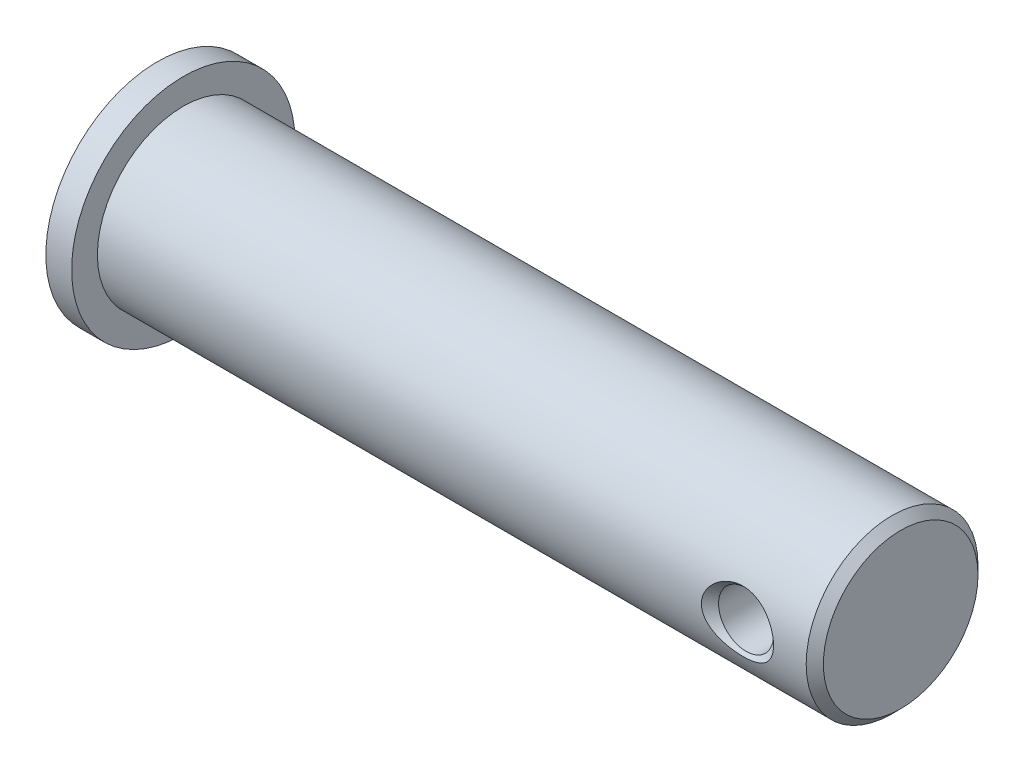
ISO-10303-21;
HEADER;
FILE_DESCRIPTION(('STEP AP214'),'2;1');
FILE_NAME('part.step','',(''),(''),'','','');
FILE_SCHEMA(('AUTOMOTIVE_DESIGN { 1 0 10303 214 1 1 1 1 }'));
ENDSEC;
DATA;
#1=APPLICATION_CONTEXT('core data for automotive mechanical design processes');
#2=APPLICATION_PROTOCOL_DEFINITION('international standard','automotive_design',2000,#1);
#3=PRODUCT_CONTEXT('',#1,'mechanical');
#4=PRODUCT('Part','Part','',(#3));
#5=PRODUCT_RELATED_PRODUCT_CATEGORY('part','',(#4));
#6=PRODUCT_DEFINITION_FORMATION('','',#4);
#7=PRODUCT_DEFINITION_CONTEXT('part definition',#1,'design');
#8=PRODUCT_DEFINITION('design','',#6,#7);
#9=PRODUCT_DEFINITION_SHAPE('','',#8);
#10=(LENGTH_UNIT() NAMED_UNIT(*) SI_UNIT(.MILLI.,.METRE.));
#11=(NAMED_UNIT(*) PLANE_ANGLE_UNIT() SI_UNIT($,.RADIAN.));
#12=(NAMED_UNIT(*) SI_UNIT($,.STERADIAN.) SOLID_ANGLE_UNIT());
#13=UNCERTAINTY_MEASURE_WITH_UNIT(LENGTH_MEASURE(1.E-05),#10,'distance_accuracy_value','');
#14=(GEOMETRIC_REPRESENTATION_CONTEXT(3) GLOBAL_UNCERTAINTY_ASSIGNED_CONTEXT((#13)) GLOBAL_UNIT_ASSIGNED_CONTEXT((#10,
#11,#12)) REPRESENTATION_CONTEXT('',''));
#15=CARTESIAN_POINT('',(0.,0.,0.));
#16=DIRECTION('',(0.,0.,1.));
#17=DIRECTION('',(1.,0.,0.));
#18=AXIS2_PLACEMENT_3D('',#15,#16,#17);
#19=CARTESIAN_POINT('',(80.5,0.,0.));
#20=DIRECTION('',(1.,0.,0.));
#21=DIRECTION('',(0.,0.,-1.));
#22=AXIS2_PLACEMENT_3D('',#19,#20,#21);
#23=CYLINDRICAL_SURFACE('',#22,10.);
#24=CARTESIAN_POINT('',(79.5,0.,0.));
#25=DIRECTION('',(1.,0.,0.));
#26=DIRECTION('',(0.,0.,-1.));
#27=AXIS2_PLACEMENT_3D('',#24,#25,#26);
#28=CIRCLE('',#27,10.);
#29=CARTESIAN_POINT('',(79.5,0.,-10.));
#30=VERTEX_POINT('',#29);
#31=EDGE_CURVE('E79',#30,#30,#28,.T.);
#32=ORIENTED_EDGE('',*,*,#31,.F.);
#33=EDGE_LOOP('',(#32));
#34=FACE_BOUND('',#33,.T.);
#35=CARTESIAN_POINT('',(68.7207995689269,-2.652458286531,9.64180822500725));
#36=CARTESIAN_POINT('',(68.9162396684258,-2.79888593025584,9.601529561183));
#37=CARTESIAN_POINT('',(69.1250545250733,-2.92815257269296,9.56240293505168));
#38=CARTESIAN_POINT('',(69.5622804572271,-3.15115567598001,9.49125843281005));
#39=CARTESIAN_POINT('',(69.7907327941659,-3.24481496641895,9.45925605827572));
#40=CARTESIAN_POINT('',(70.2620811204951,-3.39590589193739,9.40607794429715));
#41=CARTESIAN_POINT('',(70.5050556421177,-3.45311648734387,9.38496840739309));
#42=CARTESIAN_POINT('',(70.997504708861,-3.52957652742551,9.35648293032397));
#43=CARTESIAN_POINT('',(71.2469747073791,-3.54885183817462,9.34909763251438));
#44=CARTESIAN_POINT('',(71.7539876396611,-3.54921320468752,9.34896307431086));
#45=CARTESIAN_POINT('',(72.0115326583534,-3.52905352433109,9.35669124043494));
#46=CARTESIAN_POINT('',(72.5194906078579,-3.4483642676975,9.38672469455826));
#47=CARTESIAN_POINT('',(72.7698992859823,-3.38781112384351,9.4090384923952));
#48=CARTESIAN_POINT('',(73.2565097143582,-3.22713739480101,9.46534775081235));
#49=CARTESIAN_POINT('',(73.492700790871,-3.12698749925746,9.49935186237242));
#50=CARTESIAN_POINT('',(73.9434823815501,-2.88810989592092,9.57467769125102));
#51=CARTESIAN_POINT('',(74.1580836665996,-2.7494015557505,9.61599573106271));
#52=CARTESIAN_POINT('',(74.5209505621705,-2.46354346859632,9.6927098398484));
#53=CARTESIAN_POINT('',(74.6741681171345,-2.32258710214281,9.72780540134029));
#54=CARTESIAN_POINT('',(74.9553684875337,-2.01695564984647,9.79572831903019));
#55=CARTESIAN_POINT('',(75.0833840362068,-1.85231181792954,9.8285585809745));
#56=CARTESIAN_POINT('',(75.2895825772847,-1.53043212671961,9.88331330568309));
#57=CARTESIAN_POINT('',(75.3724908402262,-1.37638514864813,9.90614323536279));
#58=CARTESIAN_POINT('',(75.5123455245179,-1.05610354898767,9.94538060596304));
#59=CARTESIAN_POINT('',(75.5693069872926,-0.889876053526071,9.96179176707762));
#60=CARTESIAN_POINT('',(75.6540465556673,-0.548533950869552,9.98641559519326));
#61=CARTESIAN_POINT('',(75.6816715142743,-0.37337766075794,9.99458522750122));
#62=CARTESIAN_POINT('',(75.7051879940211,-0.0207664201440857,10.0015306572451));
#63=CARTESIAN_POINT('',(75.7010895450776,0.156687786118148,10.0003094237703));
#64=CARTESIAN_POINT('',(75.6632866686404,0.492042752687814,9.98917223335483));
#65=CARTESIAN_POINT('',(75.6322439474603,0.650280405663322,9.98003810867936));
#66=CARTESIAN_POINT('',(75.5459621837167,0.959414295070692,9.95507872016221));
#67=CARTESIAN_POINT('',(75.4907194418309,1.11030940516911,9.93925243333987));
#68=CARTESIAN_POINT('',(75.3560932013564,1.40755292934514,9.9016247506062));
#69=CARTESIAN_POINT('',(75.2758197398076,1.55346724146001,9.87960663598689));
#70=CARTESIAN_POINT('',(75.0954498288259,1.83174126829746,9.83182059238777));
#71=CARTESIAN_POINT('',(74.9953448658798,1.96409512446735,9.80605105421451));
#72=CARTESIAN_POINT('',(74.7616713100902,2.23337312259442,9.74853046864709));
#73=CARTESIAN_POINT('',(74.6253199947587,2.36781241465732,9.71647214299449));
#74=CARTESIAN_POINT('',(74.3347688306032,2.61583538230109,9.65265934687057));
#75=CARTESIAN_POINT('',(74.180557149269,2.72940510142533,9.62090509310155));
#76=CARTESIAN_POINT('',(73.8291011257122,2.9534544351064,9.55474314941758));
#77=CARTESIAN_POINT('',(73.6290887665084,3.05976467124335,9.52087342551992));
#78=CARTESIAN_POINT('',(73.214567539742,3.24182204604302,9.46043329610396));
#79=CARTESIAN_POINT('',(73.0000518137653,3.3175546053089,9.43386637447469));
#80=CARTESIAN_POINT('',(72.5378754875408,3.44418371629457,9.38843309476907));
#81=CARTESIAN_POINT('',(72.2891264091848,3.49154923056735,9.37069698902709));
#82=CARTESIAN_POINT('',(71.7867150786559,3.54718312276502,9.3497796838132));
#83=CARTESIAN_POINT('',(71.5330527270962,3.55545070897702,9.34659877907665));
#84=CARTESIAN_POINT('',(71.0231642237489,3.53254980973637,9.35527944243717));
#85=CARTESIAN_POINT('',(70.7669744221963,3.50066691204375,9.36741352443311));
#86=CARTESIAN_POINT('',(70.2638152933643,3.39674067702505,9.40559285626161));
#87=CARTESIAN_POINT('',(70.0168506790951,3.32467710348624,9.43164511543542));
#88=CARTESIAN_POINT('',(69.5391243364109,3.14125562188165,9.49430833365608));
#89=CARTESIAN_POINT('',(69.3083771840143,3.02986289348034,9.5309286439347));
#90=CARTESIAN_POINT('',(68.870710417848,2.76880363775321,9.61000828656391));
#91=CARTESIAN_POINT('',(68.6637733266237,2.61916544728393,9.65246328515283));
#92=CARTESIAN_POINT('',(68.3223454668207,2.31838754254256,9.72850444469805));
#93=CARTESIAN_POINT('',(68.1817631540105,2.17414549541338,9.76208312013869));
#94=CARTESIAN_POINT('',(67.9260220480796,1.86403374514774,9.82600276582618));
#95=CARTESIAN_POINT('',(67.8108294041086,1.69819331350534,9.85634801879863));
#96=CARTESIAN_POINT('',(67.6269946407723,1.37456750903135,9.90621469230017));
#97=CARTESIAN_POINT('',(67.5539214586599,1.21945232038074,9.92668253565411));
#98=CARTESIAN_POINT('',(67.4338113534207,0.898697391293122,9.96083721626635));
#99=CARTESIAN_POINT('',(67.3867600745744,0.733063510133141,9.97452779195793));
#100=CARTESIAN_POINT('',(67.3214492624177,0.394939819891599,9.99363708879264));
#101=CARTESIAN_POINT('',(67.3033130852644,0.22242383849768,9.99902036664391));
#102=CARTESIAN_POINT('',(67.297519893925,-0.123153966758734,10.0007332693515));
#103=CARTESIAN_POINT('',(67.3098573600038,-0.296215686100065,9.99706453381234));
#104=CARTESIAN_POINT('',(67.3621312106315,-0.624857637517196,9.98171831063807));
#105=CARTESIAN_POINT('',(67.4000192549387,-0.780800076980838,9.97063567578646));
#106=CARTESIAN_POINT('',(67.4991217191024,-1.08446626298251,9.94219389467657));
#107=CARTESIAN_POINT('',(67.560345010325,-1.23218685931332,9.92483236149661));
#108=CARTESIAN_POINT('',(67.7076501723328,-1.52531140094414,9.88416267587084));
#109=CARTESIAN_POINT('',(67.7950261333805,-1.67001787351711,9.86055516506876));
#110=CARTESIAN_POINT('',(67.9892369873501,-1.94490380337981,9.81004068919931));
#111=CARTESIAN_POINT('',(68.0960655211576,-2.07508798569518,9.78313480331887));
#112=CARTESIAN_POINT('',(68.2890548318941,-2.28061807182305,9.736840324921));
#113=CARTESIAN_POINT('',(68.3708847474004,-2.36017819838192,9.71780243965988));
#114=CARTESIAN_POINT('',(68.5411033279806,-2.51189340446557,9.67969529344084));
#115=CARTESIAN_POINT('',(68.6294918147562,-2.58404868516825,9.66062603334964));
#116=CARTESIAN_POINT('',(68.7207995689269,-2.652458286531,9.64180822500725));
#117=B_SPLINE_CURVE_WITH_KNOTS('',3,(#35,#36,#37,#38,#39,#40,#41,#42,#43,#44,#45,#46,#47,#48,
#49,#50,#51,#52,#53,#54,#55,#56,#57,#58,#59,#60,#61,#62,#63,#64,#65,#66,#67,#68,#69,#70,#71,#72,
#73,#74,#75,#76,#77,#78,#79,#80,#81,#82,#83,#84,#85,#86,#87,#88,#89,#90,#91,#92,#93,#94,#95,#96,
#97,#98,#99,#100,#101,#102,#103,#104,#105,#106,#107,#108,#109,#110,#111,#112,#113,#114,#115,
#116),.UNSPECIFIED.,.T.,.F.,(4,2,2,2,2,2,2,2,2,2,2,2,2,2,2,2,2,2,2,2,2,2,2,2,2,2,2,2,2,2,2,2,2,
2,2,2,2,2,2,2,4),(0.,0.742098438565734,1.48579615174851,2.23396206426232,2.9816176648374,
3.75327300188976,4.52537895569235,5.29805751193416,6.07034865654456,6.70126618637176,
7.33135877247464,7.85844771509439,8.38523071286466,8.91475038678981,9.44410265054025,
9.92644184828222,10.4088548042714,10.9108760191246,11.4131132167236,11.99338211054,
12.5740376561215,13.2583296763615,13.9429475819511,14.7009283718756,15.4589245104544,
16.2306005248716,17.0026655303423,17.775415810034,18.5475951944257,19.1578173898083,
19.7672210161245,20.2830945245216,20.798683152083,21.3164655282784,21.8341541246793,
22.3146174192971,22.7952635542398,23.3053820917631,23.8153341681462,24.162044916984,
24.5087462437472),.UNSPECIFIED.);
#118=CARTESIAN_POINT('',(68.7207995689269,-2.652458286531,9.64180822500725));
#119=VERTEX_POINT('',#118);
#120=EDGE_CURVE('E26',#119,#119,#117,.T.);
#121=ORIENTED_EDGE('',*,*,#120,.F.);
#122=EDGE_LOOP('',(#121));
#123=FACE_BOUND('',#122,.T.);
#124=CARTESIAN_POINT('',(-3.,0.,0.));
#125=DIRECTION('',(1.,0.,0.));
#126=DIRECTION('',(0.,0.,-1.));
#127=AXIS2_PLACEMENT_3D('',#124,#125,#126);
#128=CIRCLE('',#127,10.);
#129=CARTESIAN_POINT('',(-3.,0.,-10.));
#130=VERTEX_POINT('',#129);
#131=EDGE_CURVE('E84',#130,#130,#128,.T.);
#132=ORIENTED_EDGE('',*,*,#131,.T.);
#133=EDGE_LOOP('',(#132));
#134=FACE_BOUND('',#133,.T.);
#135=CARTESIAN_POINT('',(68.7207995689269,-2.652458286531,-9.64180822500725));
#136=CARTESIAN_POINT('',(68.570674545502,-2.53997973378034,-9.67274996595369));
#137=CARTESIAN_POINT('',(68.4283255556157,-2.41729885645396,-9.7043921906314));
#138=CARTESIAN_POINT('',(68.1629307068794,-2.15222025354344,-9.76659892728099));
#139=CARTESIAN_POINT('',(68.0398809900436,-2.00982647937211,-9.7971636536987));
#140=CARTESIAN_POINT('',(67.8229553080189,-1.71409201692918,-9.853090544974));
#141=CARTESIAN_POINT('',(67.7279532359462,-1.56161809588753,-9.87863321912784));
#142=CARTESIAN_POINT('',(67.5637785508831,-1.24245785182184,-9.92382011712578));
#143=CARTESIAN_POINT('',(67.4945947602925,-1.07577771762629,-9.94346689277895));
#144=CARTESIAN_POINT('',(67.3857864793283,-0.731030891075918,-9.97475197991039));
#145=CARTESIAN_POINT('',(67.3463485058195,-0.552899828609322,-9.98633972368338));
#146=CARTESIAN_POINT('',(67.3006871050349,-0.19208233075768,-9.99978050243662));
#147=CARTESIAN_POINT('',(67.2944442631568,-0.00939862088047326,-10.0016392275494));
#148=CARTESIAN_POINT('',(67.3144508456476,0.334282979201144,-9.99573077703663));
#149=CARTESIAN_POINT('',(67.3372949652106,0.495509646743645,-9.98897232382417));
#150=CARTESIAN_POINT('',(67.4083499954111,0.811751714376884,-9.96825863991053));
#151=CARTESIAN_POINT('',(67.4565635424569,0.966766467119059,-9.95430266124056));
#152=CARTESIAN_POINT('',(67.5766973971463,1.26933276024558,-9.9203009077393));
#153=CARTESIAN_POINT('',(67.6489748497413,1.41673067455915,-9.90016376966042));
#154=CARTESIAN_POINT('',(67.8137927096571,1.69896208700442,-9.85565711039016));
#155=CARTESIAN_POINT('',(67.9063407086923,1.83379085070093,-9.83128600420439));
#156=CARTESIAN_POINT('',(68.1229987746614,2.10766351044549,-9.77650042100304));
#157=CARTESIAN_POINT('',(68.2497293159679,2.2445556643643,-9.74572003647428));
#158=CARTESIAN_POINT('',(68.5213338391407,2.49880160358973,-9.68365365046563));
#159=CARTESIAN_POINT('',(68.6662195688074,2.61614262222859,-9.65236733312945));
#160=CARTESIAN_POINT('',(68.9982345167822,2.85011388120105,-9.58614765614463));
#161=CARTESIAN_POINT('',(69.1882582827251,2.96275054364758,-9.55158283878943));
#162=CARTESIAN_POINT('',(69.5836326217572,3.1591097123569,-9.48844938355244));
#163=CARTESIAN_POINT('',(69.7889914856899,3.24281643813457,-9.45988402153066));
#164=CARTESIAN_POINT('',(70.2364048559217,3.38911404329241,-9.40854452565256));
#165=CARTESIAN_POINT('',(70.4798657672538,3.44784041562263,-9.38691514219188));
#166=CARTESIAN_POINT('',(70.9737173637616,3.52711900661055,-9.35741576235692));
#167=CARTESIAN_POINT('',(71.224108426624,3.54766914052468,-9.34954651740328));
#168=CARTESIAN_POINT('',(71.7321543596758,3.55029750314961,-9.3485515396869));
#169=CARTESIAN_POINT('',(71.9898166695128,3.53128451987057,-9.35584398514104));
#170=CARTESIAN_POINT('',(72.4981662308632,3.45287216209176,-9.38506195378871));
#171=CARTESIAN_POINT('',(72.7488506010612,3.39345635468707,-9.40699343099963));
#172=CARTESIAN_POINT('',(73.2362309923548,3.23503362038058,-9.46264145176715));
#173=CARTESIAN_POINT('',(73.4729155438558,3.13599473346348,-9.49636750607045));
#174=CARTESIAN_POINT('',(73.924906054573,2.89930929462882,-9.57127800549095));
#175=CARTESIAN_POINT('',(74.140221610409,2.76168018042784,-9.61245907894669));
#176=CARTESIAN_POINT('',(74.5051441039336,2.47733241369801,-9.68918896464328));
#177=CARTESIAN_POINT('',(74.659597298197,2.33673407845101,-9.72441339139603));
#178=CARTESIAN_POINT('',(74.9432918397284,2.03161415204182,-9.79269535865656));
#179=CARTESIAN_POINT('',(75.072565821159,1.86712401600005,-9.8257556666065));
#180=CARTESIAN_POINT('',(75.2809680777118,1.54545948636997,-9.88097244239183));
#181=CARTESIAN_POINT('',(75.3648457535864,1.39152433650081,-9.90402796576201));
#182=CARTESIAN_POINT('',(75.5066470646862,1.07130347314717,-9.94375476347446));
#183=CARTESIAN_POINT('',(75.5645857854796,0.905025004061699,-9.96042974778614));
#184=CARTESIAN_POINT('',(75.6512444926278,0.563380182526534,-9.98559207431001));
#185=CARTESIAN_POINT('',(75.6798084064635,0.387970436814674,-9.99403566977023));
#186=CARTESIAN_POINT('',(75.7050802192483,0.034675770621979,-10.0014980870487));
#187=CARTESIAN_POINT('',(75.7017987410504,-0.143208304711783,-10.0005200516961));
#188=CARTESIAN_POINT('',(75.6654141977877,-0.479230110660667,-9.98979781292637));
#189=CARTESIAN_POINT('',(75.6350336560381,-0.637699281019905,-9.98085401527683));
#190=CARTESIAN_POINT('',(75.5499864455326,-0.947385575990983,-9.95623468906715));
#191=CARTESIAN_POINT('',(75.4953161740411,-1.09860162110675,-9.9405581618971));
#192=CARTESIAN_POINT('',(75.3618866806714,-1.39626224603607,-9.90322396477021));
#193=CARTESIAN_POINT('',(75.2822782674175,-1.5422966670035,-9.88135858454411));
#194=CARTESIAN_POINT('',(75.1032046440933,-1.82089346201182,-9.83383738683377));
#195=CARTESIAN_POINT('',(75.0037309959587,-1.95345007491413,-9.80817995982722));
#196=CARTESIAN_POINT('',(74.7714784278492,-2.22311974429428,-9.75087572491624));
#197=CARTESIAN_POINT('',(74.6359284880017,-2.35777520924464,-9.7189158686221));
#198=CARTESIAN_POINT('',(74.34695433998,-2.60634216948199,-9.65523027223151));
#199=CARTESIAN_POINT('',(74.1935182135838,-2.72023970194717,-9.62350470339152));
#200=CARTESIAN_POINT('',(73.8436575227424,-2.94515812967069,-9.55730991194922));
#201=CARTESIAN_POINT('',(73.6444524052249,-3.05202156116578,-9.52336474371115));
#202=CARTESIAN_POINT('',(73.2314775448856,-3.23531671814319,-9.46266636794025));
#203=CARTESIAN_POINT('',(73.0177013088881,-3.31173477136225,-9.43591639333798));
#204=CARTESIAN_POINT('',(72.5567049177371,-3.44003111591641,-9.3899626616487));
#205=CARTESIAN_POINT('',(72.308371569228,-3.48835090576301,-9.37189138339489));
#206=CARTESIAN_POINT('',(71.8065712089036,-3.54597181874725,-9.35024267793206));
#207=CARTESIAN_POINT('',(71.5531031539678,-3.55526493206098,-9.34666822605269));
#208=CARTESIAN_POINT('',(71.0431636115429,-3.53447092663684,-9.35455220775155));
#209=CARTESIAN_POINT('',(70.7867272220119,-3.50362828000221,-9.36629906398685));
#210=CARTESIAN_POINT('',(70.2830602863291,-3.40175102420226,-9.40377650005979));
#211=CARTESIAN_POINT('',(70.0358267634348,-3.33072953375386,-9.42950251548087));
#212=CARTESIAN_POINT('',(69.6043337394344,-3.16720263821386,-9.48549861545751));
#213=CARTESIAN_POINT('',(69.4171898233271,-3.08157904098927,-9.51390678956517));
#214=CARTESIAN_POINT('',(69.0572246624501,-2.88548508388594,-9.57520386952111));
#215=CARTESIAN_POINT('',(68.8843950650349,-2.77502935575699,-9.6080901322796));
#216=CARTESIAN_POINT('',(68.7207995689269,-2.652458286531,-9.64180822500725));
#217=B_SPLINE_CURVE_WITH_KNOTS('',3,(#135,#136,#137,#138,#139,#140,#141,#142,#143,#144,#145,
#146,#147,#148,#149,#150,#151,#152,#153,#154,#155,#156,#157,#158,#159,#160,#161,#162,#163,#164,
#165,#166,#167,#168,#169,#170,#171,#172,#173,#174,#175,#176,#177,#178,#179,#180,#181,#182,#183,
#184,#185,#186,#187,#188,#189,#190,#191,#192,#193,#194,#195,#196,#197,#198,#199,#200,#201,#202,
#203,#204,#205,#206,#207,#208,#209,#210,#211,#212,#213,#214,#215,#216),.UNSPECIFIED.,.T.,.F.,(4,
2,2,2,2,2,2,2,2,2,2,2,2,2,2,2,2,2,2,2,2,2,2,2,2,2,2,2,2,2,2,2,2,2,2,2,2,2,2,2,4),(0.,
0.569887759422398,1.13966145087816,1.68178049998015,2.22366457452555,2.76891883681092,
3.31385416498088,3.80047954831463,4.28715551208357,4.78140285888217,5.27583562842343,
5.84093473846058,6.40640141775455,7.07448847440736,7.742939381138,8.4936235142706,
9.2443486398632,10.0160540396224,10.7880735004102,11.5607169323892,12.3330117920642,
12.9659644063759,13.5980911262142,14.1263473502044,14.6542959507584,15.1850353473798,
15.7155977082567,16.1982001083,16.6808741134866,17.182199122373,17.6837375314436,
18.2627278301526,18.8421061607007,19.525102321947,20.2084048550136,20.9657846362429,
21.7233198542869,22.495323523031,23.2670752717022,23.888463310316,24.5094861658113),.UNSPECIFIED.);
#218=CARTESIAN_POINT('',(68.7207995689269,-2.652458286531,-9.64180822500725));
#219=VERTEX_POINT('',#218);
#220=EDGE_CURVE('E10',#219,#219,#217,.T.);
#221=ORIENTED_EDGE('',*,*,#220,.F.);
#222=EDGE_LOOP('',(#221));
#223=FACE_BOUND('',#222,.T.);
#224=ADVANCED_FACE('F15',(#34,#123,#134,#223),#23,.T.);
#225=CARTESIAN_POINT('',(-6.,0.,0.));
#226=DIRECTION('',(1.,0.,0.));
#227=DIRECTION('',(0.,0.,-1.));
#228=AXIS2_PLACEMENT_3D('',#225,#226,#227);
#229=PLANE('',#228);
#230=CARTESIAN_POINT('',(-6.00000000000001,0.,0.));
#231=DIRECTION('',(1.,0.,0.));
#232=DIRECTION('',(0.,0.,-1.));
#233=AXIS2_PLACEMENT_3D('',#230,#231,#232);
#234=CIRCLE('',#233,13.);
#235=CARTESIAN_POINT('',(-6.00000000000001,0.,-13.));
#236=VERTEX_POINT('',#235);
#237=EDGE_CURVE('E30',#236,#236,#234,.T.);
#238=ORIENTED_EDGE('',*,*,#237,.F.);
#239=EDGE_LOOP('',(#238));
#240=FACE_BOUND('',#239,.T.);
#241=ADVANCED_FACE('F17',(#240),#229,.F.);
#242=CARTESIAN_POINT('',(80.5,0.,0.));
#243=DIRECTION('',(1.,0.,0.));
#244=DIRECTION('',(0.,0.,-1.));
#245=AXIS2_PLACEMENT_3D('',#242,#243,#244);
#246=CYLINDRICAL_SURFACE('',#245,13.);
#247=CARTESIAN_POINT('',(-3.,0.,0.));
#248=DIRECTION('',(1.,0.,0.));
#249=DIRECTION('',(0.,0.,-1.));
#250=AXIS2_PLACEMENT_3D('',#247,#248,#249);
#251=CIRCLE('',#250,13.);
#252=CARTESIAN_POINT('',(-3.,0.,-13.));
#253=VERTEX_POINT('',#252);
#254=EDGE_CURVE('E34',#253,#253,#251,.T.);
#255=ORIENTED_EDGE('',*,*,#254,.F.);
#256=EDGE_LOOP('',(#255));
#257=FACE_BOUND('',#256,.T.);
#258=ORIENTED_EDGE('',*,*,#237,.T.);
#259=EDGE_LOOP('',(#258));
#260=FACE_BOUND('',#259,.T.);
#261=ADVANCED_FACE('F66',(#257,#260),#246,.T.);
#262=CARTESIAN_POINT('',(-3.,13.,0.));
#263=DIRECTION('',(-1.,0.,0.));
#264=DIRECTION('',(0.,0.,1.));
#265=AXIS2_PLACEMENT_3D('',#262,#263,#264);
#266=PLANE('',#265);
#267=ORIENTED_EDGE('',*,*,#131,.F.);
#268=EDGE_LOOP('',(#267));
#269=FACE_BOUND('',#268,.T.);
#270=ORIENTED_EDGE('',*,*,#254,.T.);
#271=EDGE_LOOP('',(#270));
#272=FACE_BOUND('',#271,.T.);
#273=ADVANCED_FACE('F60',(#269,#272),#266,.F.);
#274=CARTESIAN_POINT('',(79.5,0.,0.));
#275=DIRECTION('',(-1.,0.,0.));
#276=DIRECTION('',(0.,0.,1.));
#277=AXIS2_PLACEMENT_3D('',#274,#275,#276);
#278=CONICAL_SURFACE('',#277,10.,0.785398163397447);
#279=CARTESIAN_POINT('',(80.5,0.,0.));
#280=DIRECTION('',(1.,0.,0.));
#281=DIRECTION('',(0.,0.,-1.));
#282=AXIS2_PLACEMENT_3D('',#279,#280,#281);
#283=CIRCLE('',#282,9.);
#284=CARTESIAN_POINT('',(80.5,0.,-9.));
#285=VERTEX_POINT('',#284);
#286=EDGE_CURVE('E87',#285,#285,#283,.T.);
#287=ORIENTED_EDGE('',*,*,#286,.F.);
#288=EDGE_LOOP('',(#287));
#289=FACE_BOUND('',#288,.T.);
#290=ORIENTED_EDGE('',*,*,#31,.T.);
#291=EDGE_LOOP('',(#290));
#292=FACE_BOUND('',#291,.T.);
#293=ADVANCED_FACE('F57',(#289,#292),#278,.T.);
#294=CARTESIAN_POINT('',(80.5,9.,0.));
#295=DIRECTION('',(-1.,0.,0.));
#296=DIRECTION('',(0.,0.,1.));
#297=AXIS2_PLACEMENT_3D('',#294,#295,#296);
#298=PLANE('',#297);
#299=ORIENTED_EDGE('',*,*,#286,.T.);
#300=EDGE_LOOP('',(#299));
#301=FACE_BOUND('',#300,.T.);
#302=ADVANCED_FACE('F54',(#301),#298,.F.);
#303=CARTESIAN_POINT('',(71.5,0.,-10.));
#304=DIRECTION('',(0.,0.,-1.));
#305=DIRECTION('',(-1.,0.,0.));
#306=AXIS2_PLACEMENT_3D('',#303,#304,#305);
#307=CONICAL_SURFACE('',#306,4.2,0.78539816339745);
#308=CARTESIAN_POINT('',(71.5,0.,-9.));
#309=DIRECTION('',(0.,0.,1.));
#310=DIRECTION('',(1.,0.,0.));
#311=AXIS2_PLACEMENT_3D('',#308,#309,#310);
#312=CIRCLE('',#311,3.19999999999999);
#313=CARTESIAN_POINT('',(74.7,0.,-9.));
#314=VERTEX_POINT('',#313);
#315=EDGE_CURVE('E92',#314,#314,#312,.T.);
#316=ORIENTED_EDGE('',*,*,#315,.T.);
#317=EDGE_LOOP('',(#316));
#318=FACE_BOUND('',#317,.T.);
#319=ORIENTED_EDGE('',*,*,#220,.T.);
#320=EDGE_LOOP('',(#319));
#321=FACE_BOUND('',#320,.T.);
#322=ADVANCED_FACE('F48',(#318,#321),#307,.F.);
#323=CARTESIAN_POINT('',(71.5,0.,9.));
#324=DIRECTION('',(0.,0.,1.));
#325=DIRECTION('',(1.,0.,0.));
#326=AXIS2_PLACEMENT_3D('',#323,#324,#325);
#327=CONICAL_SURFACE('',#326,3.19999999999999,0.785398163397449);
#328=ORIENTED_EDGE('',*,*,#120,.T.);
#329=EDGE_LOOP('',(#328));
#330=FACE_BOUND('',#329,.T.);
#331=CARTESIAN_POINT('',(71.5,0.,9.));
#332=DIRECTION('',(0.,0.,1.));
#333=DIRECTION('',(1.,0.,0.));
#334=AXIS2_PLACEMENT_3D('',#331,#332,#333);
#335=CIRCLE('',#334,3.19999999999999);
#336=CARTESIAN_POINT('',(74.7,0.,9.));
#337=VERTEX_POINT('',#336);
#338=EDGE_CURVE('E95',#337,#337,#335,.T.);
#339=ORIENTED_EDGE('',*,*,#338,.F.);
#340=EDGE_LOOP('',(#339));
#341=FACE_BOUND('',#340,.T.);
#342=ADVANCED_FACE('F43',(#330,#341),#327,.F.);
#343=CARTESIAN_POINT('',(71.5,0.,10.));
#344=DIRECTION('',(0.,0.,1.));
#345=DIRECTION('',(1.,0.,0.));
#346=AXIS2_PLACEMENT_3D('',#343,#344,#345);
#347=CYLINDRICAL_SURFACE('',#346,3.19999999999999);
#348=ORIENTED_EDGE('',*,*,#338,.T.);
#349=EDGE_LOOP('',(#348));
#350=FACE_BOUND('',#349,.T.);
#351=ORIENTED_EDGE('',*,*,#315,.F.);
#352=EDGE_LOOP('',(#351));
#353=FACE_BOUND('',#352,.T.);
#354=ADVANCED_FACE('F47',(#350,#353),#347,.F.);
#355=CLOSED_SHELL('',(#224,#241,#261,#273,#293,#302,#322,#342,#354));
#356=MANIFOLD_SOLID_BREP('B1',#355);
#357=ADVANCED_BREP_SHAPE_REPRESENTATION('',(#18,#356),#14);
#358=SHAPE_DEFINITION_REPRESENTATION(#9,#357);
ENDSEC;
END-ISO-10303-21;
